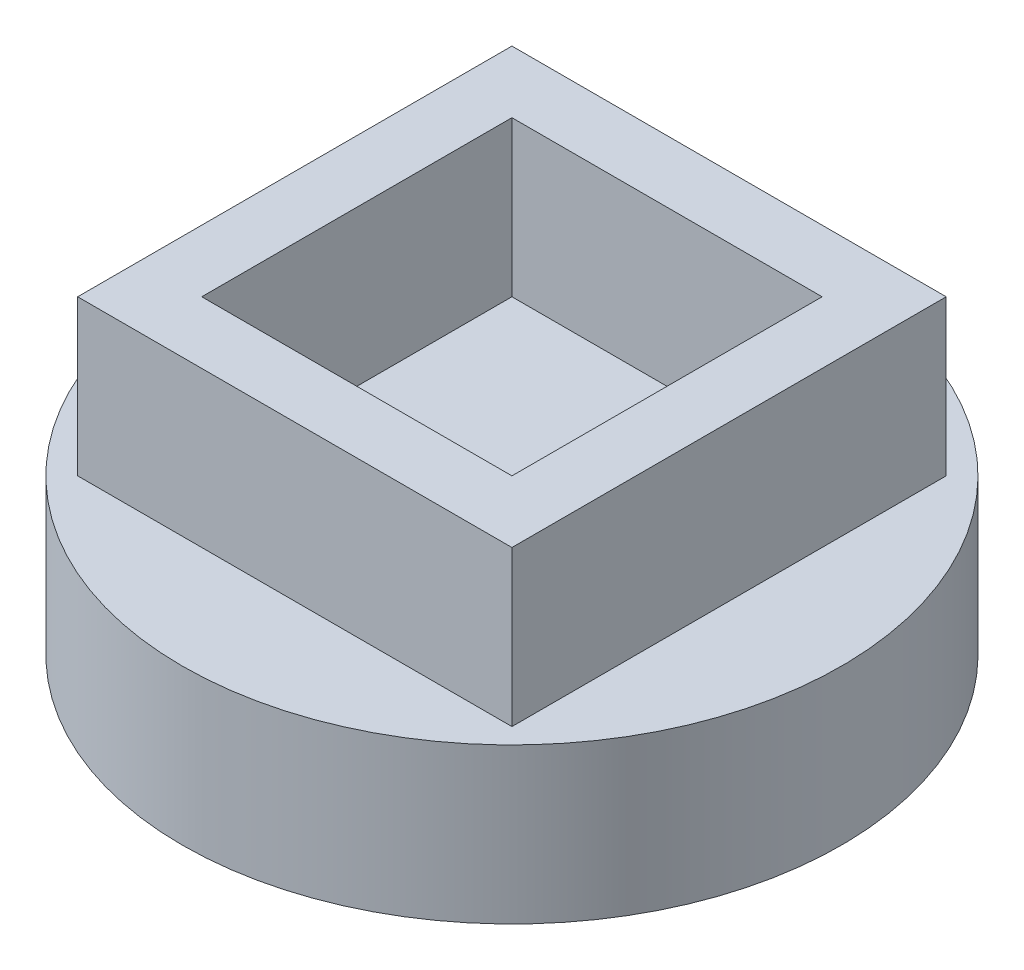
ISO-10303-21;
HEADER;
FILE_DESCRIPTION(('STEP AP214'),'2;1');
FILE_NAME('part.step','',(''),(''),'','','');
FILE_SCHEMA(('AUTOMOTIVE_DESIGN { 1 0 10303 214 1 1 1 1 }'));
ENDSEC;
DATA;
#1=APPLICATION_CONTEXT('core data for automotive mechanical design processes');
#2=APPLICATION_PROTOCOL_DEFINITION('international standard','automotive_design',2000,#1);
#3=PRODUCT_CONTEXT('',#1,'mechanical');
#4=PRODUCT('Part','Part','',(#3));
#5=PRODUCT_RELATED_PRODUCT_CATEGORY('part','',(#4));
#6=PRODUCT_DEFINITION_FORMATION('','',#4);
#7=PRODUCT_DEFINITION_CONTEXT('part definition',#1,'design');
#8=PRODUCT_DEFINITION('design','',#6,#7);
#9=PRODUCT_DEFINITION_SHAPE('','',#8);
#10=(LENGTH_UNIT() NAMED_UNIT(*) SI_UNIT(.MILLI.,.METRE.));
#11=(NAMED_UNIT(*) PLANE_ANGLE_UNIT() SI_UNIT($,.RADIAN.));
#12=(NAMED_UNIT(*) SI_UNIT($,.STERADIAN.) SOLID_ANGLE_UNIT());
#13=UNCERTAINTY_MEASURE_WITH_UNIT(LENGTH_MEASURE(1.E-05),#10,'distance_accuracy_value','');
#14=(GEOMETRIC_REPRESENTATION_CONTEXT(3) GLOBAL_UNCERTAINTY_ASSIGNED_CONTEXT((#13)) GLOBAL_UNIT_ASSIGNED_CONTEXT((#10,
#11,#12)) REPRESENTATION_CONTEXT('',''));
#15=CARTESIAN_POINT('',(0.,0.,0.));
#16=DIRECTION('',(0.,0.,1.));
#17=DIRECTION('',(1.,0.,0.));
#18=AXIS2_PLACEMENT_3D('',#15,#16,#17);
#19=CARTESIAN_POINT('',(0.,2.,0.));
#20=DIRECTION('',(0.,1.,0.));
#21=DIRECTION('',(0.,0.,1.));
#22=AXIS2_PLACEMENT_3D('',#19,#20,#21);
#23=PLANE('',#22);
#24=CARTESIAN_POINT('',(0.,2.,0.));
#25=DIRECTION('',(0.,1.,0.));
#26=DIRECTION('',(0.,0.,1.));
#27=AXIS2_PLACEMENT_3D('',#24,#25,#26);
#28=CIRCLE('',#27,4.25);
#29=CARTESIAN_POINT('',(0.,2.,4.25));
#30=VERTEX_POINT('',#29);
#31=EDGE_CURVE('E11',#30,#30,#28,.T.);
#32=ORIENTED_EDGE('',*,*,#31,.T.);
#33=EDGE_LOOP('',(#32));
#34=FACE_BOUND('',#33,.T.);
#35=DIRECTION('',(0.,0.,1.));
#36=VECTOR('',#35,1.);
#37=CARTESIAN_POINT('',(-2.8,2.,-2.8));
#38=LINE('',#37,#36);
#39=CARTESIAN_POINT('',(-2.8,2.,-2.8));
#40=VERTEX_POINT('',#39);
#41=CARTESIAN_POINT('',(-2.8,2.,2.8));
#42=VERTEX_POINT('',#41);
#43=EDGE_CURVE('E156',#40,#42,#38,.T.);
#44=ORIENTED_EDGE('',*,*,#43,.F.);
#45=DIRECTION('',(-1.,0.,0.));
#46=VECTOR('',#45,1.);
#47=CARTESIAN_POINT('',(-2.8,2.,-2.8));
#48=LINE('',#47,#46);
#49=CARTESIAN_POINT('',(2.8,2.,-2.8));
#50=VERTEX_POINT('',#49);
#51=EDGE_CURVE('E121',#50,#40,#48,.T.);
#52=ORIENTED_EDGE('',*,*,#51,.F.);
#53=DIRECTION('',(0.,0.,-1.));
#54=VECTOR('',#53,1.);
#55=CARTESIAN_POINT('',(2.8,2.,-2.8));
#56=LINE('',#55,#54);
#57=CARTESIAN_POINT('',(2.8,2.,2.8));
#58=VERTEX_POINT('',#57);
#59=EDGE_CURVE('E147',#58,#50,#56,.T.);
#60=ORIENTED_EDGE('',*,*,#59,.F.);
#61=DIRECTION('',(1.,0.,0.));
#62=VECTOR('',#61,1.);
#63=CARTESIAN_POINT('',(-2.8,2.,2.8));
#64=LINE('',#63,#62);
#65=EDGE_CURVE('E158',#42,#58,#64,.T.);
#66=ORIENTED_EDGE('',*,*,#65,.F.);
#67=EDGE_LOOP('',(#44,#52,#60,#66));
#68=FACE_BOUND('',#67,.T.);
#69=ADVANCED_FACE('F37',(#34,#68),#23,.T.);
#70=CARTESIAN_POINT('',(0.,2.,0.));
#71=DIRECTION('',(0.,-1.,0.));
#72=DIRECTION('',(0.,0.,-1.));
#73=AXIS2_PLACEMENT_3D('',#70,#71,#72);
#74=CYLINDRICAL_SURFACE('',#73,4.25);
#75=ORIENTED_EDGE('',*,*,#31,.F.);
#76=EDGE_LOOP('',(#75));
#77=FACE_BOUND('',#76,.T.);
#78=CARTESIAN_POINT('',(0.,0.,0.));
#79=DIRECTION('',(0.,1.,0.));
#80=DIRECTION('',(0.,0.,1.));
#81=AXIS2_PLACEMENT_3D('',#78,#79,#80);
#82=CIRCLE('',#81,4.25);
#83=CARTESIAN_POINT('',(0.,0.,4.25));
#84=VERTEX_POINT('',#83);
#85=EDGE_CURVE('E41',#84,#84,#82,.T.);
#86=ORIENTED_EDGE('',*,*,#85,.T.);
#87=EDGE_LOOP('',(#86));
#88=FACE_BOUND('',#87,.T.);
#89=ADVANCED_FACE('F39',(#77,#88),#74,.T.);
#90=CARTESIAN_POINT('',(0.,0.,0.));
#91=DIRECTION('',(0.,1.,0.));
#92=DIRECTION('',(0.,0.,1.));
#93=AXIS2_PLACEMENT_3D('',#90,#91,#92);
#94=PLANE('',#93);
#95=ORIENTED_EDGE('',*,*,#85,.F.);
#96=EDGE_LOOP('',(#95));
#97=FACE_BOUND('',#96,.T.);
#98=ADVANCED_FACE('F174',(#97),#94,.F.);
#99=CARTESIAN_POINT('',(0.,4.,0.));
#100=DIRECTION('',(0.,-1.,0.));
#101=DIRECTION('',(0.,0.,-1.));
#102=AXIS2_PLACEMENT_3D('',#99,#100,#101);
#103=PLANE('',#102);
#104=DIRECTION('',(-1.,0.,0.));
#105=VECTOR('',#104,1.);
#106=CARTESIAN_POINT('',(-2.8,4.,-2.8));
#107=LINE('',#106,#105);
#108=CARTESIAN_POINT('',(2.8,4.,-2.8));
#109=VERTEX_POINT('',#108);
#110=CARTESIAN_POINT('',(-2.8,4.,-2.8));
#111=VERTEX_POINT('',#110);
#112=EDGE_CURVE('E143',#109,#111,#107,.T.);
#113=ORIENTED_EDGE('',*,*,#112,.T.);
#114=DIRECTION('',(0.,0.,1.));
#115=VECTOR('',#114,1.);
#116=CARTESIAN_POINT('',(-2.8,4.,-2.8));
#117=LINE('',#116,#115);
#118=CARTESIAN_POINT('',(-2.8,4.,2.8));
#119=VERTEX_POINT('',#118);
#120=EDGE_CURVE('E146',#111,#119,#117,.T.);
#121=ORIENTED_EDGE('',*,*,#120,.T.);
#122=DIRECTION('',(1.,0.,0.));
#123=VECTOR('',#122,1.);
#124=CARTESIAN_POINT('',(-2.8,4.,2.8));
#125=LINE('',#124,#123);
#126=CARTESIAN_POINT('',(2.8,4.,2.8));
#127=VERTEX_POINT('',#126);
#128=EDGE_CURVE('E149',#119,#127,#125,.T.);
#129=ORIENTED_EDGE('',*,*,#128,.T.);
#130=DIRECTION('',(0.,0.,-1.));
#131=VECTOR('',#130,1.);
#132=CARTESIAN_POINT('',(2.8,4.,-2.8));
#133=LINE('',#132,#131);
#134=EDGE_CURVE('E151',#127,#109,#133,.T.);
#135=ORIENTED_EDGE('',*,*,#134,.T.);
#136=EDGE_LOOP('',(#113,#121,#129,#135));
#137=FACE_BOUND('',#136,.T.);
#138=DIRECTION('',(0.,0.,-1.));
#139=VECTOR('',#138,1.);
#140=CARTESIAN_POINT('',(2.,4.,-2.));
#141=LINE('',#140,#139);
#142=CARTESIAN_POINT('',(2.,4.,2.));
#143=VERTEX_POINT('',#142);
#144=CARTESIAN_POINT('',(2.,4.,-2.));
#145=VERTEX_POINT('',#144);
#146=EDGE_CURVE('E104',#143,#145,#141,.T.);
#147=ORIENTED_EDGE('',*,*,#146,.F.);
#148=DIRECTION('',(1.,0.,0.));
#149=VECTOR('',#148,1.);
#150=CARTESIAN_POINT('',(-2.,4.,2.));
#151=LINE('',#150,#149);
#152=CARTESIAN_POINT('',(-2.,4.,2.));
#153=VERTEX_POINT('',#152);
#154=EDGE_CURVE('E129',#153,#143,#151,.T.);
#155=ORIENTED_EDGE('',*,*,#154,.F.);
#156=DIRECTION('',(0.,0.,1.));
#157=VECTOR('',#156,1.);
#158=CARTESIAN_POINT('',(-2.,4.,-2.));
#159=LINE('',#158,#157);
#160=CARTESIAN_POINT('',(-2.,4.,-2.));
#161=VERTEX_POINT('',#160);
#162=EDGE_CURVE('E127',#161,#153,#159,.T.);
#163=ORIENTED_EDGE('',*,*,#162,.F.);
#164=DIRECTION('',(-1.,0.,0.));
#165=VECTOR('',#164,1.);
#166=CARTESIAN_POINT('',(-2.,4.,-2.));
#167=LINE('',#166,#165);
#168=EDGE_CURVE('E113',#145,#161,#167,.T.);
#169=ORIENTED_EDGE('',*,*,#168,.F.);
#170=EDGE_LOOP('',(#147,#155,#163,#169));
#171=FACE_BOUND('',#170,.T.);
#172=ADVANCED_FACE('F125',(#137,#171),#103,.F.);
#173=CARTESIAN_POINT('',(-2.8,4.,-2.8));
#174=DIRECTION('',(0.,0.,1.));
#175=DIRECTION('',(1.,0.,0.));
#176=AXIS2_PLACEMENT_3D('',#173,#174,#175);
#177=PLANE('',#176);
#178=ORIENTED_EDGE('',*,*,#51,.T.);
#179=DIRECTION('',(0.,-1.,0.));
#180=VECTOR('',#179,1.);
#181=CARTESIAN_POINT('',(-2.8,4.,-2.8));
#182=LINE('',#181,#180);
#183=EDGE_CURVE('E167',#111,#40,#182,.T.);
#184=ORIENTED_EDGE('',*,*,#183,.F.);
#185=ORIENTED_EDGE('',*,*,#112,.F.);
#186=DIRECTION('',(0.,-1.,0.));
#187=VECTOR('',#186,1.);
#188=CARTESIAN_POINT('',(2.8,4.,-2.8));
#189=LINE('',#188,#187);
#190=EDGE_CURVE('E153',#109,#50,#189,.T.);
#191=ORIENTED_EDGE('',*,*,#190,.T.);
#192=EDGE_LOOP('',(#178,#184,#185,#191));
#193=FACE_BOUND('',#192,.T.);
#194=ADVANCED_FACE('F180',(#193),#177,.F.);
#195=CARTESIAN_POINT('',(-2.8,4.,-2.8));
#196=DIRECTION('',(1.,0.,0.));
#197=DIRECTION('',(0.,0.,-1.));
#198=AXIS2_PLACEMENT_3D('',#195,#196,#197);
#199=PLANE('',#198);
#200=ORIENTED_EDGE('',*,*,#43,.T.);
#201=DIRECTION('',(0.,-1.,0.));
#202=VECTOR('',#201,1.);
#203=CARTESIAN_POINT('',(-2.8,4.,2.8));
#204=LINE('',#203,#202);
#205=EDGE_CURVE('E164',#119,#42,#204,.T.);
#206=ORIENTED_EDGE('',*,*,#205,.F.);
#207=ORIENTED_EDGE('',*,*,#120,.F.);
#208=ORIENTED_EDGE('',*,*,#183,.T.);
#209=EDGE_LOOP('',(#200,#206,#207,#208));
#210=FACE_BOUND('',#209,.T.);
#211=ADVANCED_FACE('F217',(#210),#199,.F.);
#212=CARTESIAN_POINT('',(-2.8,4.,2.8));
#213=DIRECTION('',(0.,0.,-1.));
#214=DIRECTION('',(-1.,0.,0.));
#215=AXIS2_PLACEMENT_3D('',#212,#213,#214);
#216=PLANE('',#215);
#217=ORIENTED_EDGE('',*,*,#65,.T.);
#218=DIRECTION('',(0.,-1.,0.));
#219=VECTOR('',#218,1.);
#220=CARTESIAN_POINT('',(2.8,4.,2.8));
#221=LINE('',#220,#219);
#222=EDGE_CURVE('E52',#127,#58,#221,.T.);
#223=ORIENTED_EDGE('',*,*,#222,.F.);
#224=ORIENTED_EDGE('',*,*,#128,.F.);
#225=ORIENTED_EDGE('',*,*,#205,.T.);
#226=EDGE_LOOP('',(#217,#223,#224,#225));
#227=FACE_BOUND('',#226,.T.);
#228=ADVANCED_FACE('F214',(#227),#216,.F.);
#229=CARTESIAN_POINT('',(2.8,4.,-2.8));
#230=DIRECTION('',(-1.,0.,0.));
#231=DIRECTION('',(0.,0.,1.));
#232=AXIS2_PLACEMENT_3D('',#229,#230,#231);
#233=PLANE('',#232);
#234=ORIENTED_EDGE('',*,*,#59,.T.);
#235=ORIENTED_EDGE('',*,*,#190,.F.);
#236=ORIENTED_EDGE('',*,*,#134,.F.);
#237=ORIENTED_EDGE('',*,*,#222,.T.);
#238=EDGE_LOOP('',(#234,#235,#236,#237));
#239=FACE_BOUND('',#238,.T.);
#240=ADVANCED_FACE('F210',(#239),#233,.F.);
#241=CARTESIAN_POINT('',(2.,4.,-2.));
#242=DIRECTION('',(-1.,0.,0.));
#243=DIRECTION('',(0.,0.,1.));
#244=AXIS2_PLACEMENT_3D('',#241,#242,#243);
#245=PLANE('',#244);
#246=DIRECTION('',(0.,0.,-1.));
#247=VECTOR('',#246,1.);
#248=CARTESIAN_POINT('',(2.,2.,-2.));
#249=LINE('',#248,#247);
#250=CARTESIAN_POINT('',(2.,2.,2.));
#251=VERTEX_POINT('',#250);
#252=CARTESIAN_POINT('',(2.,2.,-2.));
#253=VERTEX_POINT('',#252);
#254=EDGE_CURVE('E60',#251,#253,#249,.T.);
#255=ORIENTED_EDGE('',*,*,#254,.F.);
#256=DIRECTION('',(0.,-1.,0.));
#257=VECTOR('',#256,1.);
#258=CARTESIAN_POINT('',(2.,4.,2.));
#259=LINE('',#258,#257);
#260=EDGE_CURVE('E109',#143,#251,#259,.T.);
#261=ORIENTED_EDGE('',*,*,#260,.F.);
#262=ORIENTED_EDGE('',*,*,#146,.T.);
#263=DIRECTION('',(0.,-1.,0.));
#264=VECTOR('',#263,1.);
#265=CARTESIAN_POINT('',(2.,4.,-2.));
#266=LINE('',#265,#264);
#267=EDGE_CURVE('E107',#145,#253,#266,.T.);
#268=ORIENTED_EDGE('',*,*,#267,.T.);
#269=EDGE_LOOP('',(#255,#261,#262,#268));
#270=FACE_BOUND('',#269,.T.);
#271=ADVANCED_FACE('F106',(#270),#245,.T.);
#272=CARTESIAN_POINT('',(-2.,4.,-2.));
#273=DIRECTION('',(0.,0.,1.));
#274=DIRECTION('',(1.,0.,0.));
#275=AXIS2_PLACEMENT_3D('',#272,#273,#274);
#276=PLANE('',#275);
#277=DIRECTION('',(-1.,0.,0.));
#278=VECTOR('',#277,1.);
#279=CARTESIAN_POINT('',(-2.,2.,-2.));
#280=LINE('',#279,#278);
#281=CARTESIAN_POINT('',(-2.,2.,-2.));
#282=VERTEX_POINT('',#281);
#283=EDGE_CURVE('E120',#253,#282,#280,.T.);
#284=ORIENTED_EDGE('',*,*,#283,.F.);
#285=ORIENTED_EDGE('',*,*,#267,.F.);
#286=ORIENTED_EDGE('',*,*,#168,.T.);
#287=DIRECTION('',(0.,-1.,0.));
#288=VECTOR('',#287,1.);
#289=CARTESIAN_POINT('',(-2.,4.,-2.));
#290=LINE('',#289,#288);
#291=EDGE_CURVE('E122',#161,#282,#290,.T.);
#292=ORIENTED_EDGE('',*,*,#291,.T.);
#293=EDGE_LOOP('',(#284,#285,#286,#292));
#294=FACE_BOUND('',#293,.T.);
#295=ADVANCED_FACE('F117',(#294),#276,.T.);
#296=CARTESIAN_POINT('',(-2.,4.,-2.));
#297=DIRECTION('',(1.,0.,0.));
#298=DIRECTION('',(0.,0.,-1.));
#299=AXIS2_PLACEMENT_3D('',#296,#297,#298);
#300=PLANE('',#299);
#301=DIRECTION('',(0.,0.,1.));
#302=VECTOR('',#301,1.);
#303=CARTESIAN_POINT('',(-2.,2.,-2.));
#304=LINE('',#303,#302);
#305=CARTESIAN_POINT('',(-2.,2.,2.));
#306=VERTEX_POINT('',#305);
#307=EDGE_CURVE('E135',#282,#306,#304,.T.);
#308=ORIENTED_EDGE('',*,*,#307,.F.);
#309=ORIENTED_EDGE('',*,*,#291,.F.);
#310=ORIENTED_EDGE('',*,*,#162,.T.);
#311=DIRECTION('',(0.,-1.,0.));
#312=VECTOR('',#311,1.);
#313=CARTESIAN_POINT('',(-2.,4.,2.));
#314=LINE('',#313,#312);
#315=EDGE_CURVE('E139',#153,#306,#314,.T.);
#316=ORIENTED_EDGE('',*,*,#315,.T.);
#317=EDGE_LOOP('',(#308,#309,#310,#316));
#318=FACE_BOUND('',#317,.T.);
#319=ADVANCED_FACE('F197',(#318),#300,.T.);
#320=CARTESIAN_POINT('',(-2.,4.,2.));
#321=DIRECTION('',(0.,0.,-1.));
#322=DIRECTION('',(-1.,0.,0.));
#323=AXIS2_PLACEMENT_3D('',#320,#321,#322);
#324=PLANE('',#323);
#325=DIRECTION('',(1.,0.,0.));
#326=VECTOR('',#325,1.);
#327=CARTESIAN_POINT('',(-2.,2.,2.));
#328=LINE('',#327,#326);
#329=EDGE_CURVE('E114',#306,#251,#328,.T.);
#330=ORIENTED_EDGE('',*,*,#329,.F.);
#331=ORIENTED_EDGE('',*,*,#315,.F.);
#332=ORIENTED_EDGE('',*,*,#154,.T.);
#333=ORIENTED_EDGE('',*,*,#260,.T.);
#334=EDGE_LOOP('',(#330,#331,#332,#333));
#335=FACE_BOUND('',#334,.T.);
#336=ADVANCED_FACE('F193',(#335),#324,.T.);
#337=ORIENTED_EDGE('',*,*,#254,.T.);
#338=ORIENTED_EDGE('',*,*,#283,.T.);
#339=ORIENTED_EDGE('',*,*,#307,.T.);
#340=ORIENTED_EDGE('',*,*,#329,.T.);
#341=EDGE_LOOP('',(#337,#338,#339,#340));
#342=FACE_BOUND('',#341,.T.);
#343=ADVANCED_FACE('F187',(#342),#23,.T.);
#344=CLOSED_SHELL('',(#69,#89,#98,#172,#194,#211,#228,#240,#271,#295,#319,#336,#343));
#345=MANIFOLD_SOLID_BREP('B2',#344);
#346=ADVANCED_BREP_SHAPE_REPRESENTATION('',(#18,#345),#14);
#347=SHAPE_DEFINITION_REPRESENTATION(#9,#346);
ENDSEC;
END-ISO-10303-21;
